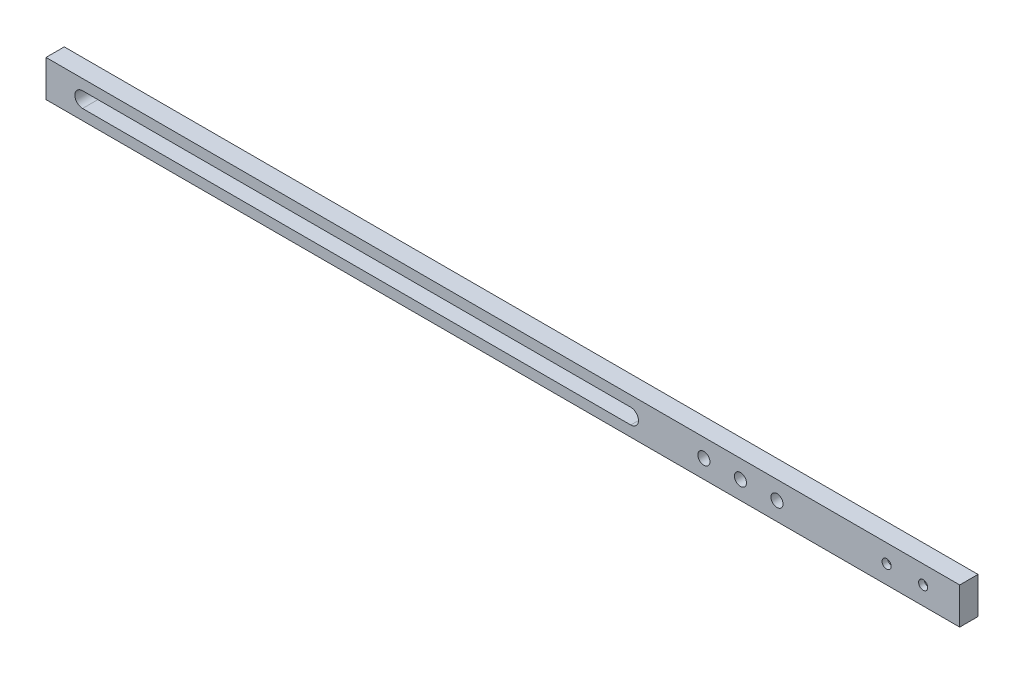
ISO-10303-21;
HEADER;
FILE_DESCRIPTION(('STEP AP214'),'2;1');
FILE_NAME('part.step','',(''),(''),'','','');
FILE_SCHEMA(('AUTOMOTIVE_DESIGN { 1 0 10303 214 1 1 1 1 }'));
ENDSEC;
DATA;
#1=APPLICATION_CONTEXT('core data for automotive mechanical design processes');
#2=APPLICATION_PROTOCOL_DEFINITION('international standard','automotive_design',2000,#1);
#3=PRODUCT_CONTEXT('',#1,'mechanical');
#4=PRODUCT('Part','Part','',(#3));
#5=PRODUCT_RELATED_PRODUCT_CATEGORY('part','',(#4));
#6=PRODUCT_DEFINITION_FORMATION('','',#4);
#7=PRODUCT_DEFINITION_CONTEXT('part definition',#1,'design');
#8=PRODUCT_DEFINITION('design','',#6,#7);
#9=PRODUCT_DEFINITION_SHAPE('','',#8);
#10=(LENGTH_UNIT() NAMED_UNIT(*) SI_UNIT(.MILLI.,.METRE.));
#11=(NAMED_UNIT(*) PLANE_ANGLE_UNIT() SI_UNIT($,.RADIAN.));
#12=(NAMED_UNIT(*) SI_UNIT($,.STERADIAN.) SOLID_ANGLE_UNIT());
#13=UNCERTAINTY_MEASURE_WITH_UNIT(LENGTH_MEASURE(1.E-05),#10,'distance_accuracy_value','');
#14=(GEOMETRIC_REPRESENTATION_CONTEXT(3) GLOBAL_UNCERTAINTY_ASSIGNED_CONTEXT((#13)) GLOBAL_UNIT_ASSIGNED_CONTEXT((#10,
#11,#12)) REPRESENTATION_CONTEXT('',''));
#15=CARTESIAN_POINT('',(0.,0.,0.));
#16=DIRECTION('',(0.,0.,1.));
#17=DIRECTION('',(1.,0.,0.));
#18=AXIS2_PLACEMENT_3D('',#15,#16,#17);
#19=CARTESIAN_POINT('',(105.,0.,5.));
#20=DIRECTION('',(0.,0.,-1.));
#21=DIRECTION('',(-1.,0.,0.));
#22=AXIS2_PLACEMENT_3D('',#19,#20,#21);
#23=CYLINDRICAL_SURFACE('',#22,1.25);
#24=CARTESIAN_POINT('',(105.,0.,5.));
#25=DIRECTION('',(0.,0.,-1.));
#26=DIRECTION('',(-1.,0.,0.));
#27=AXIS2_PLACEMENT_3D('',#24,#25,#26);
#28=CIRCLE('',#27,1.25);
#29=CARTESIAN_POINT('',(103.75,0.,5.));
#30=VERTEX_POINT('',#29);
#31=EDGE_CURVE('E168',#30,#30,#28,.T.);
#32=ORIENTED_EDGE('',*,*,#31,.F.);
#33=EDGE_LOOP('',(#32));
#34=FACE_BOUND('',#33,.T.);
#35=CARTESIAN_POINT('',(105.,0.,3.5));
#36=DIRECTION('',(0.,0.,-1.));
#37=DIRECTION('',(-1.,0.,0.));
#38=AXIS2_PLACEMENT_3D('',#35,#36,#37);
#39=CIRCLE('',#38,1.25);
#40=CARTESIAN_POINT('',(103.75,0.,3.5));
#41=VERTEX_POINT('',#40);
#42=EDGE_CURVE('E39',#41,#41,#39,.F.);
#43=ORIENTED_EDGE('',*,*,#42,.F.);
#44=EDGE_LOOP('',(#43));
#45=FACE_BOUND('',#44,.T.);
#46=ADVANCED_FACE('F35',(#34,#45),#23,.F.);
#47=CARTESIAN_POINT('',(115.,0.,5.));
#48=DIRECTION('',(0.,0.,-1.));
#49=DIRECTION('',(-1.,0.,0.));
#50=AXIS2_PLACEMENT_3D('',#47,#48,#49);
#51=CYLINDRICAL_SURFACE('',#50,1.25);
#52=CARTESIAN_POINT('',(115.,0.,5.));
#53=DIRECTION('',(0.,0.,-1.));
#54=DIRECTION('',(-1.,0.,0.));
#55=AXIS2_PLACEMENT_3D('',#52,#53,#54);
#56=CIRCLE('',#55,1.25);
#57=CARTESIAN_POINT('',(113.75,0.,5.));
#58=VERTEX_POINT('',#57);
#59=EDGE_CURVE('E126',#58,#58,#56,.T.);
#60=ORIENTED_EDGE('',*,*,#59,.F.);
#61=EDGE_LOOP('',(#60));
#62=FACE_BOUND('',#61,.T.);
#63=CARTESIAN_POINT('',(115.,0.,3.5));
#64=DIRECTION('',(0.,0.,-1.));
#65=DIRECTION('',(-1.,0.,0.));
#66=AXIS2_PLACEMENT_3D('',#63,#64,#65);
#67=CIRCLE('',#66,1.25);
#68=CARTESIAN_POINT('',(113.75,0.,3.5));
#69=VERTEX_POINT('',#68);
#70=EDGE_CURVE('E166',#69,#69,#67,.F.);
#71=ORIENTED_EDGE('',*,*,#70,.F.);
#72=EDGE_LOOP('',(#71));
#73=FACE_BOUND('',#72,.T.);
#74=ADVANCED_FACE('F251',(#62,#73),#51,.F.);
#75=CARTESIAN_POINT('',(125.,5.,5.));
#76=DIRECTION('',(-1.,0.,0.));
#77=DIRECTION('',(0.,0.,1.));
#78=AXIS2_PLACEMENT_3D('',#75,#76,#77);
#79=PLANE('',#78);
#80=DIRECTION('',(0.,1.,0.));
#81=VECTOR('',#80,1.);
#82=CARTESIAN_POINT('',(125.,5.,0.));
#83=LINE('',#82,#81);
#84=CARTESIAN_POINT('',(125.,-5.,0.));
#85=VERTEX_POINT('',#84);
#86=CARTESIAN_POINT('',(125.,5.,0.));
#87=VERTEX_POINT('',#86);
#88=EDGE_CURVE('E138',#85,#87,#83,.T.);
#89=ORIENTED_EDGE('',*,*,#88,.T.);
#90=DIRECTION('',(0.,0.,-1.));
#91=VECTOR('',#90,1.);
#92=CARTESIAN_POINT('',(125.,5.,5.));
#93=LINE('',#92,#91);
#94=CARTESIAN_POINT('',(125.,5.,5.));
#95=VERTEX_POINT('',#94);
#96=EDGE_CURVE('E11',#95,#87,#93,.T.);
#97=ORIENTED_EDGE('',*,*,#96,.F.);
#98=DIRECTION('',(0.,1.,0.));
#99=VECTOR('',#98,1.);
#100=CARTESIAN_POINT('',(125.,5.,5.));
#101=LINE('',#100,#99);
#102=CARTESIAN_POINT('',(125.,-5.,5.));
#103=VERTEX_POINT('',#102);
#104=EDGE_CURVE('E142',#103,#95,#101,.T.);
#105=ORIENTED_EDGE('',*,*,#104,.F.);
#106=DIRECTION('',(0.,0.,-1.));
#107=VECTOR('',#106,1.);
#108=CARTESIAN_POINT('',(125.,-5.,5.));
#109=LINE('',#108,#107);
#110=EDGE_CURVE('E152',#103,#85,#109,.T.);
#111=ORIENTED_EDGE('',*,*,#110,.T.);
#112=EDGE_LOOP('',(#89,#97,#105,#111));
#113=FACE_BOUND('',#112,.T.);
#114=ADVANCED_FACE('F37',(#113),#79,.F.);
#115=CARTESIAN_POINT('',(-125.,5.,5.));
#116=DIRECTION('',(0.,-1.,0.));
#117=DIRECTION('',(0.,0.,-1.));
#118=AXIS2_PLACEMENT_3D('',#115,#116,#117);
#119=PLANE('',#118);
#120=DIRECTION('',(-1.,0.,0.));
#121=VECTOR('',#120,1.);
#122=CARTESIAN_POINT('',(-125.,5.,0.));
#123=LINE('',#122,#121);
#124=CARTESIAN_POINT('',(-125.,5.,0.));
#125=VERTEX_POINT('',#124);
#126=EDGE_CURVE('E155',#87,#125,#123,.T.);
#127=ORIENTED_EDGE('',*,*,#126,.T.);
#128=DIRECTION('',(0.,0.,-1.));
#129=VECTOR('',#128,1.);
#130=CARTESIAN_POINT('',(-125.,5.,5.));
#131=LINE('',#130,#129);
#132=CARTESIAN_POINT('',(-125.,5.,5.));
#133=VERTEX_POINT('',#132);
#134=EDGE_CURVE('E44',#133,#125,#131,.T.);
#135=ORIENTED_EDGE('',*,*,#134,.F.);
#136=DIRECTION('',(-1.,0.,0.));
#137=VECTOR('',#136,1.);
#138=CARTESIAN_POINT('',(-125.,5.,5.));
#139=LINE('',#138,#137);
#140=EDGE_CURVE('E145',#95,#133,#139,.T.);
#141=ORIENTED_EDGE('',*,*,#140,.F.);
#142=ORIENTED_EDGE('',*,*,#96,.T.);
#143=EDGE_LOOP('',(#127,#135,#141,#142));
#144=FACE_BOUND('',#143,.T.);
#145=ADVANCED_FACE('F238',(#144),#119,.F.);
#146=CARTESIAN_POINT('',(-125.,5.,5.));
#147=DIRECTION('',(1.,0.,0.));
#148=DIRECTION('',(0.,0.,-1.));
#149=AXIS2_PLACEMENT_3D('',#146,#147,#148);
#150=PLANE('',#149);
#151=DIRECTION('',(0.,-1.,0.));
#152=VECTOR('',#151,1.);
#153=CARTESIAN_POINT('',(-125.,5.,0.));
#154=LINE('',#153,#152);
#155=CARTESIAN_POINT('',(-125.,-5.,0.));
#156=VERTEX_POINT('',#155);
#157=EDGE_CURVE('E157',#125,#156,#154,.T.);
#158=ORIENTED_EDGE('',*,*,#157,.T.);
#159=DIRECTION('',(0.,0.,-1.));
#160=VECTOR('',#159,1.);
#161=CARTESIAN_POINT('',(-125.,-5.,5.));
#162=LINE('',#161,#160);
#163=CARTESIAN_POINT('',(-125.,-5.,5.));
#164=VERTEX_POINT('',#163);
#165=EDGE_CURVE('E162',#164,#156,#162,.T.);
#166=ORIENTED_EDGE('',*,*,#165,.F.);
#167=DIRECTION('',(0.,-1.,0.));
#168=VECTOR('',#167,1.);
#169=CARTESIAN_POINT('',(-125.,5.,5.));
#170=LINE('',#169,#168);
#171=EDGE_CURVE('E148',#133,#164,#170,.T.);
#172=ORIENTED_EDGE('',*,*,#171,.F.);
#173=ORIENTED_EDGE('',*,*,#134,.T.);
#174=EDGE_LOOP('',(#158,#166,#172,#173));
#175=FACE_BOUND('',#174,.T.);
#176=ADVANCED_FACE('F235',(#175),#150,.F.);
#177=CARTESIAN_POINT('',(-125.,-5.,5.));
#178=DIRECTION('',(0.,1.,0.));
#179=DIRECTION('',(0.,0.,1.));
#180=AXIS2_PLACEMENT_3D('',#177,#178,#179);
#181=PLANE('',#180);
#182=DIRECTION('',(1.,0.,0.));
#183=VECTOR('',#182,1.);
#184=CARTESIAN_POINT('',(-125.,-5.,0.));
#185=LINE('',#184,#183);
#186=EDGE_CURVE('E146',#156,#85,#185,.T.);
#187=ORIENTED_EDGE('',*,*,#186,.T.);
#188=ORIENTED_EDGE('',*,*,#110,.F.);
#189=DIRECTION('',(1.,0.,0.));
#190=VECTOR('',#189,1.);
#191=CARTESIAN_POINT('',(-125.,-5.,5.));
#192=LINE('',#191,#190);
#193=EDGE_CURVE('E150',#164,#103,#192,.T.);
#194=ORIENTED_EDGE('',*,*,#193,.F.);
#195=ORIENTED_EDGE('',*,*,#165,.T.);
#196=EDGE_LOOP('',(#187,#188,#194,#195));
#197=FACE_BOUND('',#196,.T.);
#198=ADVANCED_FACE('F231',(#197),#181,.F.);
#199=CARTESIAN_POINT('',(0.,0.,5.));
#200=DIRECTION('',(0.,0.,1.));
#201=DIRECTION('',(1.,0.,0.));
#202=AXIS2_PLACEMENT_3D('',#199,#200,#201);
#203=PLANE('',#202);
#204=CARTESIAN_POINT('',(55.,0.,5.));
#205=DIRECTION('',(0.,0.,1.));
#206=DIRECTION('',(1.,0.,0.));
#207=AXIS2_PLACEMENT_3D('',#204,#205,#206);
#208=CIRCLE('',#207,1.65);
#209=CARTESIAN_POINT('',(56.65,0.,5.));
#210=VERTEX_POINT('',#209);
#211=EDGE_CURVE('E199',#210,#210,#208,.T.);
#212=ORIENTED_EDGE('',*,*,#211,.F.);
#213=EDGE_LOOP('',(#212));
#214=FACE_BOUND('',#213,.T.);
#215=CARTESIAN_POINT('',(65.,0.,5.));
#216=DIRECTION('',(0.,0.,1.));
#217=DIRECTION('',(1.,0.,0.));
#218=AXIS2_PLACEMENT_3D('',#215,#216,#217);
#219=CIRCLE('',#218,1.65);
#220=CARTESIAN_POINT('',(66.65,0.,5.));
#221=VERTEX_POINT('',#220);
#222=EDGE_CURVE('E193',#221,#221,#219,.T.);
#223=ORIENTED_EDGE('',*,*,#222,.F.);
#224=EDGE_LOOP('',(#223));
#225=FACE_BOUND('',#224,.T.);
#226=CARTESIAN_POINT('',(75.,0.,5.));
#227=DIRECTION('',(0.,0.,1.));
#228=DIRECTION('',(1.,0.,0.));
#229=AXIS2_PLACEMENT_3D('',#226,#227,#228);
#230=CIRCLE('',#229,1.65);
#231=CARTESIAN_POINT('',(76.65,0.,5.));
#232=VERTEX_POINT('',#231);
#233=EDGE_CURVE('E185',#232,#232,#230,.T.);
#234=ORIENTED_EDGE('',*,*,#233,.F.);
#235=EDGE_LOOP('',(#234));
#236=FACE_BOUND('',#235,.T.);
#237=ORIENTED_EDGE('',*,*,#31,.T.);
#238=EDGE_LOOP('',(#237));
#239=FACE_BOUND('',#238,.T.);
#240=ORIENTED_EDGE('',*,*,#59,.T.);
#241=EDGE_LOOP('',(#240));
#242=FACE_BOUND('',#241,.T.);
#243=CARTESIAN_POINT('',(-115.,0.,5.));
#244=DIRECTION('',(0.,0.,-1.));
#245=DIRECTION('',(1.,0.,0.));
#246=AXIS2_PLACEMENT_3D('',#243,#244,#245);
#247=CIRCLE('',#246,2.1);
#248=CARTESIAN_POINT('',(-115.,-2.1,5.));
#249=VERTEX_POINT('',#248);
#250=CARTESIAN_POINT('',(-115.,2.1,5.));
#251=VERTEX_POINT('',#250);
#252=EDGE_CURVE('E104',#249,#251,#247,.T.);
#253=ORIENTED_EDGE('',*,*,#252,.T.);
#254=DIRECTION('',(1.,0.,0.));
#255=VECTOR('',#254,1.);
#256=CARTESIAN_POINT('',(35.,2.1,5.));
#257=LINE('',#256,#255);
#258=CARTESIAN_POINT('',(35.,2.1,5.));
#259=VERTEX_POINT('',#258);
#260=EDGE_CURVE('E113',#251,#259,#257,.T.);
#261=ORIENTED_EDGE('',*,*,#260,.T.);
#262=CARTESIAN_POINT('',(35.,0.,5.));
#263=DIRECTION('',(0.,0.,-1.));
#264=DIRECTION('',(-1.,0.,0.));
#265=AXIS2_PLACEMENT_3D('',#262,#263,#264);
#266=CIRCLE('',#265,2.1);
#267=CARTESIAN_POINT('',(35.,-2.1,5.));
#268=VERTEX_POINT('',#267);
#269=EDGE_CURVE('E52',#259,#268,#266,.T.);
#270=ORIENTED_EDGE('',*,*,#269,.T.);
#271=DIRECTION('',(-1.,0.,0.));
#272=VECTOR('',#271,1.);
#273=CARTESIAN_POINT('',(35.,-2.1,5.));
#274=LINE('',#273,#272);
#275=EDGE_CURVE('E110',#268,#249,#274,.T.);
#276=ORIENTED_EDGE('',*,*,#275,.T.);
#277=EDGE_LOOP('',(#253,#261,#270,#276));
#278=FACE_BOUND('',#277,.T.);
#279=ORIENTED_EDGE('',*,*,#104,.T.);
#280=ORIENTED_EDGE('',*,*,#140,.T.);
#281=ORIENTED_EDGE('',*,*,#171,.T.);
#282=ORIENTED_EDGE('',*,*,#193,.T.);
#283=EDGE_LOOP('',(#279,#280,#281,#282));
#284=FACE_BOUND('',#283,.T.);
#285=ADVANCED_FACE('F117',(#214,#225,#236,#239,#242,#278,#284),#203,.T.);
#286=CARTESIAN_POINT('',(0.,0.,0.));
#287=DIRECTION('',(0.,0.,1.));
#288=DIRECTION('',(1.,0.,0.));
#289=AXIS2_PLACEMENT_3D('',#286,#287,#288);
#290=PLANE('',#289);
#291=CARTESIAN_POINT('',(55.,0.,0.));
#292=DIRECTION('',(0.,0.,-1.));
#293=DIRECTION('',(-1.,0.,0.));
#294=AXIS2_PLACEMENT_3D('',#291,#292,#293);
#295=CIRCLE('',#294,1.65);
#296=CARTESIAN_POINT('',(53.35,0.,0.));
#297=VERTEX_POINT('',#296);
#298=EDGE_CURVE('E202',#297,#297,#295,.T.);
#299=ORIENTED_EDGE('',*,*,#298,.F.);
#300=EDGE_LOOP('',(#299));
#301=FACE_BOUND('',#300,.T.);
#302=CARTESIAN_POINT('',(65.,0.,0.));
#303=DIRECTION('',(0.,0.,-1.));
#304=DIRECTION('',(-1.,0.,0.));
#305=AXIS2_PLACEMENT_3D('',#302,#303,#304);
#306=CIRCLE('',#305,1.65);
#307=CARTESIAN_POINT('',(63.35,0.,0.));
#308=VERTEX_POINT('',#307);
#309=EDGE_CURVE('E196',#308,#308,#306,.T.);
#310=ORIENTED_EDGE('',*,*,#309,.F.);
#311=EDGE_LOOP('',(#310));
#312=FACE_BOUND('',#311,.T.);
#313=CARTESIAN_POINT('',(75.,0.,0.));
#314=DIRECTION('',(0.,0.,-1.));
#315=DIRECTION('',(-1.,0.,0.));
#316=AXIS2_PLACEMENT_3D('',#313,#314,#315);
#317=CIRCLE('',#316,1.65);
#318=CARTESIAN_POINT('',(73.35,0.,0.));
#319=VERTEX_POINT('',#318);
#320=EDGE_CURVE('E190',#319,#319,#317,.T.);
#321=ORIENTED_EDGE('',*,*,#320,.F.);
#322=EDGE_LOOP('',(#321));
#323=FACE_BOUND('',#322,.T.);
#324=CARTESIAN_POINT('',(105.,0.,0.));
#325=DIRECTION('',(0.,0.,-1.));
#326=DIRECTION('',(-1.,0.,0.));
#327=AXIS2_PLACEMENT_3D('',#324,#325,#326);
#328=CIRCLE('',#327,2.79999999999999);
#329=CARTESIAN_POINT('',(102.2,0.,0.));
#330=VERTEX_POINT('',#329);
#331=EDGE_CURVE('E181',#330,#330,#328,.T.);
#332=ORIENTED_EDGE('',*,*,#331,.F.);
#333=EDGE_LOOP('',(#332));
#334=FACE_BOUND('',#333,.T.);
#335=CARTESIAN_POINT('',(115.,0.,0.));
#336=DIRECTION('',(0.,0.,-1.));
#337=DIRECTION('',(-1.,0.,0.));
#338=AXIS2_PLACEMENT_3D('',#335,#336,#337);
#339=CIRCLE('',#338,2.79999999999999);
#340=CARTESIAN_POINT('',(112.2,0.,0.));
#341=VERTEX_POINT('',#340);
#342=EDGE_CURVE('E174',#341,#341,#339,.T.);
#343=ORIENTED_EDGE('',*,*,#342,.F.);
#344=EDGE_LOOP('',(#343));
#345=FACE_BOUND('',#344,.T.);
#346=DIRECTION('',(1.,0.,0.));
#347=VECTOR('',#346,1.);
#348=CARTESIAN_POINT('',(35.,2.1,0.));
#349=LINE('',#348,#347);
#350=CARTESIAN_POINT('',(-115.,2.1,0.));
#351=VERTEX_POINT('',#350);
#352=CARTESIAN_POINT('',(35.,2.1,0.));
#353=VERTEX_POINT('',#352);
#354=EDGE_CURVE('E132',#351,#353,#349,.T.);
#355=ORIENTED_EDGE('',*,*,#354,.F.);
#356=CARTESIAN_POINT('',(-115.,0.,0.));
#357=DIRECTION('',(0.,0.,-1.));
#358=DIRECTION('',(1.,0.,0.));
#359=AXIS2_PLACEMENT_3D('',#356,#357,#358);
#360=CIRCLE('',#359,2.1);
#361=CARTESIAN_POINT('',(-115.,-2.1,0.));
#362=VERTEX_POINT('',#361);
#363=EDGE_CURVE('E60',#362,#351,#360,.T.);
#364=ORIENTED_EDGE('',*,*,#363,.F.);
#365=DIRECTION('',(-1.,0.,0.));
#366=VECTOR('',#365,1.);
#367=CARTESIAN_POINT('',(35.,-2.1,0.));
#368=LINE('',#367,#366);
#369=CARTESIAN_POINT('',(35.,-2.1,0.));
#370=VERTEX_POINT('',#369);
#371=EDGE_CURVE('E120',#370,#362,#368,.T.);
#372=ORIENTED_EDGE('',*,*,#371,.F.);
#373=CARTESIAN_POINT('',(35.,0.,0.));
#374=DIRECTION('',(0.,0.,-1.));
#375=DIRECTION('',(-1.,0.,0.));
#376=AXIS2_PLACEMENT_3D('',#373,#374,#375);
#377=CIRCLE('',#376,2.1);
#378=EDGE_CURVE('E123',#353,#370,#377,.T.);
#379=ORIENTED_EDGE('',*,*,#378,.F.);
#380=EDGE_LOOP('',(#355,#364,#372,#379));
#381=FACE_BOUND('',#380,.T.);
#382=ORIENTED_EDGE('',*,*,#88,.F.);
#383=ORIENTED_EDGE('',*,*,#186,.F.);
#384=ORIENTED_EDGE('',*,*,#157,.F.);
#385=ORIENTED_EDGE('',*,*,#126,.F.);
#386=EDGE_LOOP('',(#382,#383,#384,#385));
#387=FACE_BOUND('',#386,.T.);
#388=ADVANCED_FACE('F208',(#301,#312,#323,#334,#345,#381,#387),#290,.F.);
#389=CARTESIAN_POINT('',(-115.,0.,5.));
#390=DIRECTION('',(0.,0.,-1.));
#391=DIRECTION('',(-1.,0.,0.));
#392=AXIS2_PLACEMENT_3D('',#389,#390,#391);
#393=CYLINDRICAL_SURFACE('',#392,2.1);
#394=ORIENTED_EDGE('',*,*,#363,.T.);
#395=DIRECTION('',(0.,0.,-1.));
#396=VECTOR('',#395,1.);
#397=CARTESIAN_POINT('',(-115.,2.1,5.));
#398=LINE('',#397,#396);
#399=EDGE_CURVE('E100',#251,#351,#398,.T.);
#400=ORIENTED_EDGE('',*,*,#399,.F.);
#401=ORIENTED_EDGE('',*,*,#252,.F.);
#402=DIRECTION('',(0.,0.,-1.));
#403=VECTOR('',#402,1.);
#404=CARTESIAN_POINT('',(-115.,-2.1,5.));
#405=LINE('',#404,#403);
#406=EDGE_CURVE('E136',#249,#362,#405,.T.);
#407=ORIENTED_EDGE('',*,*,#406,.T.);
#408=EDGE_LOOP('',(#394,#400,#401,#407));
#409=FACE_BOUND('',#408,.T.);
#410=ADVANCED_FACE('F102',(#409),#393,.F.);
#411=CARTESIAN_POINT('',(35.,-2.1,5.));
#412=DIRECTION('',(0.,-1.,0.));
#413=DIRECTION('',(0.,0.,-1.));
#414=AXIS2_PLACEMENT_3D('',#411,#412,#413);
#415=PLANE('',#414);
#416=ORIENTED_EDGE('',*,*,#371,.T.);
#417=ORIENTED_EDGE('',*,*,#406,.F.);
#418=ORIENTED_EDGE('',*,*,#275,.F.);
#419=DIRECTION('',(0.,0.,-1.));
#420=VECTOR('',#419,1.);
#421=CARTESIAN_POINT('',(35.,-2.1,5.));
#422=LINE('',#421,#420);
#423=EDGE_CURVE('E139',#268,#370,#422,.T.);
#424=ORIENTED_EDGE('',*,*,#423,.T.);
#425=EDGE_LOOP('',(#416,#417,#418,#424));
#426=FACE_BOUND('',#425,.T.);
#427=ADVANCED_FACE('F266',(#426),#415,.F.);
#428=CARTESIAN_POINT('',(35.,0.,5.));
#429=DIRECTION('',(0.,0.,-1.));
#430=DIRECTION('',(-1.,0.,0.));
#431=AXIS2_PLACEMENT_3D('',#428,#429,#430);
#432=CYLINDRICAL_SURFACE('',#431,2.1);
#433=ORIENTED_EDGE('',*,*,#378,.T.);
#434=ORIENTED_EDGE('',*,*,#423,.F.);
#435=ORIENTED_EDGE('',*,*,#269,.F.);
#436=DIRECTION('',(0.,0.,-1.));
#437=VECTOR('',#436,1.);
#438=CARTESIAN_POINT('',(35.,2.1,5.));
#439=LINE('',#438,#437);
#440=EDGE_CURVE('E109',#259,#353,#439,.T.);
#441=ORIENTED_EDGE('',*,*,#440,.T.);
#442=EDGE_LOOP('',(#433,#434,#435,#441));
#443=FACE_BOUND('',#442,.T.);
#444=ADVANCED_FACE('F269',(#443),#432,.F.);
#445=CARTESIAN_POINT('',(35.,2.1,5.));
#446=DIRECTION('',(0.,1.,0.));
#447=DIRECTION('',(0.,0.,1.));
#448=AXIS2_PLACEMENT_3D('',#445,#446,#447);
#449=PLANE('',#448);
#450=ORIENTED_EDGE('',*,*,#354,.T.);
#451=ORIENTED_EDGE('',*,*,#440,.F.);
#452=ORIENTED_EDGE('',*,*,#260,.F.);
#453=ORIENTED_EDGE('',*,*,#399,.T.);
#454=EDGE_LOOP('',(#450,#451,#452,#453));
#455=FACE_BOUND('',#454,.T.);
#456=ADVANCED_FACE('F114',(#455),#449,.F.);
#457=CARTESIAN_POINT('',(115.,0.,3.5));
#458=DIRECTION('',(0.,0.,-1.));
#459=DIRECTION('',(-1.,0.,0.));
#460=AXIS2_PLACEMENT_3D('',#457,#458,#459);
#461=PLANE('',#460);
#462=CARTESIAN_POINT('',(115.,0.,3.5));
#463=DIRECTION('',(0.,0.,-1.));
#464=DIRECTION('',(-1.,0.,0.));
#465=AXIS2_PLACEMENT_3D('',#462,#463,#464);
#466=CIRCLE('',#465,2.79999999999999);
#467=CARTESIAN_POINT('',(112.2,0.,3.5));
#468=VERTEX_POINT('',#467);
#469=EDGE_CURVE('E169',#468,#468,#466,.T.);
#470=ORIENTED_EDGE('',*,*,#469,.T.);
#471=EDGE_LOOP('',(#470));
#472=FACE_BOUND('',#471,.T.);
#473=ORIENTED_EDGE('',*,*,#70,.T.);
#474=EDGE_LOOP('',(#473));
#475=FACE_BOUND('',#474,.T.);
#476=ADVANCED_FACE('F274',(#472,#475),#461,.T.);
#477=CARTESIAN_POINT('',(115.,0.,3.5));
#478=DIRECTION('',(0.,0.,-1.));
#479=DIRECTION('',(-1.,0.,0.));
#480=AXIS2_PLACEMENT_3D('',#477,#478,#479);
#481=CYLINDRICAL_SURFACE('',#480,2.79999999999999);
#482=ORIENTED_EDGE('',*,*,#469,.F.);
#483=EDGE_LOOP('',(#482));
#484=FACE_BOUND('',#483,.T.);
#485=ORIENTED_EDGE('',*,*,#342,.T.);
#486=EDGE_LOOP('',(#485));
#487=FACE_BOUND('',#486,.T.);
#488=ADVANCED_FACE('F263',(#484,#487),#481,.F.);
#489=CARTESIAN_POINT('',(105.,0.,3.5));
#490=DIRECTION('',(0.,0.,-1.));
#491=DIRECTION('',(-1.,0.,0.));
#492=AXIS2_PLACEMENT_3D('',#489,#490,#491);
#493=PLANE('',#492);
#494=CARTESIAN_POINT('',(105.,0.,3.5));
#495=DIRECTION('',(0.,0.,-1.));
#496=DIRECTION('',(-1.,0.,0.));
#497=AXIS2_PLACEMENT_3D('',#494,#495,#496);
#498=CIRCLE('',#497,2.79999999999999);
#499=CARTESIAN_POINT('',(102.2,0.,3.5));
#500=VERTEX_POINT('',#499);
#501=EDGE_CURVE('E184',#500,#500,#498,.T.);
#502=ORIENTED_EDGE('',*,*,#501,.T.);
#503=EDGE_LOOP('',(#502));
#504=FACE_BOUND('',#503,.T.);
#505=ORIENTED_EDGE('',*,*,#42,.T.);
#506=EDGE_LOOP('',(#505));
#507=FACE_BOUND('',#506,.T.);
#508=ADVANCED_FACE('F304',(#504,#507),#493,.T.);
#509=CARTESIAN_POINT('',(105.,0.,3.5));
#510=DIRECTION('',(0.,0.,-1.));
#511=DIRECTION('',(-1.,0.,0.));
#512=AXIS2_PLACEMENT_3D('',#509,#510,#511);
#513=CYLINDRICAL_SURFACE('',#512,2.79999999999999);
#514=ORIENTED_EDGE('',*,*,#501,.F.);
#515=EDGE_LOOP('',(#514));
#516=FACE_BOUND('',#515,.T.);
#517=ORIENTED_EDGE('',*,*,#331,.T.);
#518=EDGE_LOOP('',(#517));
#519=FACE_BOUND('',#518,.T.);
#520=ADVANCED_FACE('F311',(#516,#519),#513,.F.);
#521=CARTESIAN_POINT('',(75.,0.,10.));
#522=DIRECTION('',(0.,0.,-1.));
#523=DIRECTION('',(-1.,0.,0.));
#524=AXIS2_PLACEMENT_3D('',#521,#522,#523);
#525=CYLINDRICAL_SURFACE('',#524,1.65);
#526=ORIENTED_EDGE('',*,*,#233,.T.);
#527=EDGE_LOOP('',(#526));
#528=FACE_BOUND('',#527,.T.);
#529=ORIENTED_EDGE('',*,*,#320,.T.);
#530=EDGE_LOOP('',(#529));
#531=FACE_BOUND('',#530,.T.);
#532=ADVANCED_FACE('F318',(#528,#531),#525,.F.);
#533=CARTESIAN_POINT('',(65.,0.,10.));
#534=DIRECTION('',(0.,0.,-1.));
#535=DIRECTION('',(-1.,0.,0.));
#536=AXIS2_PLACEMENT_3D('',#533,#534,#535);
#537=CYLINDRICAL_SURFACE('',#536,1.65);
#538=ORIENTED_EDGE('',*,*,#222,.T.);
#539=EDGE_LOOP('',(#538));
#540=FACE_BOUND('',#539,.T.);
#541=ORIENTED_EDGE('',*,*,#309,.T.);
#542=EDGE_LOOP('',(#541));
#543=FACE_BOUND('',#542,.T.);
#544=ADVANCED_FACE('F326',(#540,#543),#537,.F.);
#545=CARTESIAN_POINT('',(55.,0.,10.));
#546=DIRECTION('',(0.,0.,-1.));
#547=DIRECTION('',(-1.,0.,0.));
#548=AXIS2_PLACEMENT_3D('',#545,#546,#547);
#549=CYLINDRICAL_SURFACE('',#548,1.65);
#550=ORIENTED_EDGE('',*,*,#211,.T.);
#551=EDGE_LOOP('',(#550));
#552=FACE_BOUND('',#551,.T.);
#553=ORIENTED_EDGE('',*,*,#298,.T.);
#554=EDGE_LOOP('',(#553));
#555=FACE_BOUND('',#554,.T.);
#556=ADVANCED_FACE('F206',(#552,#555),#549,.F.);
#557=CLOSED_SHELL('',(#46,#74,#114,#145,#176,#198,#285,#388,#410,#427,#444,#456,#476,#488,#508,
#520,#532,#544,#556));
#558=MANIFOLD_SOLID_BREP('B2',#557);
#559=ADVANCED_BREP_SHAPE_REPRESENTATION('',(#18,#558),#14);
#560=SHAPE_DEFINITION_REPRESENTATION(#9,#559);
ENDSEC;
END-ISO-10303-21;
